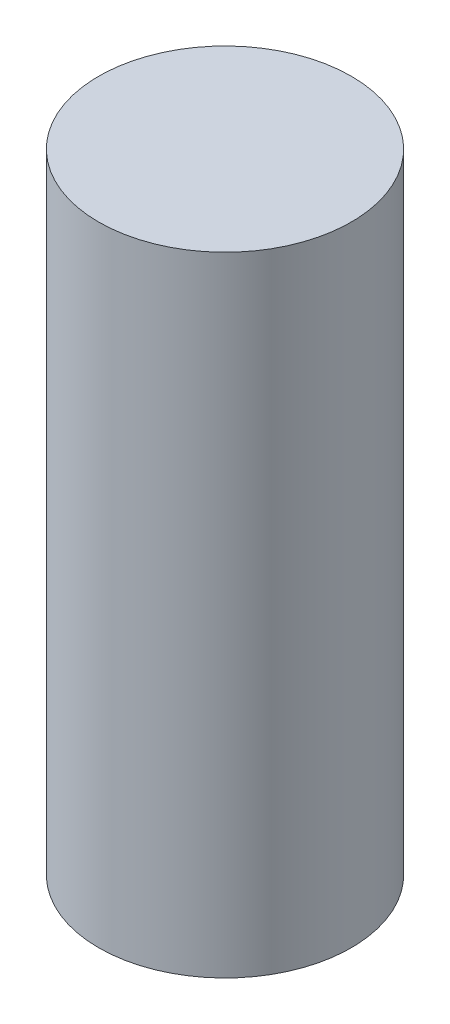
ISO-10303-21;
HEADER;
FILE_DESCRIPTION(('STEP AP214'),'2;1');
FILE_NAME('part.step','',(''),(''),'','','');
FILE_SCHEMA(('AUTOMOTIVE_DESIGN { 1 0 10303 214 1 1 1 1 }'));
ENDSEC;
DATA;
#1=APPLICATION_CONTEXT('core data for automotive mechanical design processes');
#2=APPLICATION_PROTOCOL_DEFINITION('international standard','automotive_design',2000,#1);
#3=PRODUCT_CONTEXT('',#1,'mechanical');
#4=PRODUCT('Part','Part','',(#3));
#5=PRODUCT_RELATED_PRODUCT_CATEGORY('part','',(#4));
#6=PRODUCT_DEFINITION_FORMATION('','',#4);
#7=PRODUCT_DEFINITION_CONTEXT('part definition',#1,'design');
#8=PRODUCT_DEFINITION('design','',#6,#7);
#9=PRODUCT_DEFINITION_SHAPE('','',#8);
#10=(LENGTH_UNIT() NAMED_UNIT(*) SI_UNIT(.MILLI.,.METRE.));
#11=(NAMED_UNIT(*) PLANE_ANGLE_UNIT() SI_UNIT($,.RADIAN.));
#12=(NAMED_UNIT(*) SI_UNIT($,.STERADIAN.) SOLID_ANGLE_UNIT());
#13=UNCERTAINTY_MEASURE_WITH_UNIT(LENGTH_MEASURE(1.E-05),#10,'distance_accuracy_value','');
#14=(GEOMETRIC_REPRESENTATION_CONTEXT(3) GLOBAL_UNCERTAINTY_ASSIGNED_CONTEXT((#13)) GLOBAL_UNIT_ASSIGNED_CONTEXT((#10,
#11,#12)) REPRESENTATION_CONTEXT('',''));
#15=CARTESIAN_POINT('',(0.,0.,0.));
#16=DIRECTION('',(0.,0.,1.));
#17=DIRECTION('',(1.,0.,0.));
#18=AXIS2_PLACEMENT_3D('',#15,#16,#17);
#19=CARTESIAN_POINT('',(0.,12.7,0.));
#20=DIRECTION('',(0.,-1.,0.));
#21=DIRECTION('',(0.,0.,-1.));
#22=AXIS2_PLACEMENT_3D('',#19,#20,#21);
#23=CYLINDRICAL_SURFACE('',#22,2.5527);
#24=CARTESIAN_POINT('',(0.,12.7,0.));
#25=DIRECTION('',(0.,1.,0.));
#26=DIRECTION('',(0.,0.,1.));
#27=AXIS2_PLACEMENT_3D('',#24,#25,#26);
#28=CIRCLE('',#27,2.5527);
#29=CARTESIAN_POINT('',(0.,12.7,2.5527));
#30=VERTEX_POINT('',#29);
#31=EDGE_CURVE('E10',#30,#30,#28,.T.);
#32=ORIENTED_EDGE('',*,*,#31,.F.);
#33=EDGE_LOOP('',(#32));
#34=FACE_BOUND('',#33,.T.);
#35=CARTESIAN_POINT('',(0.,0.,0.));
#36=DIRECTION('',(0.,1.,0.));
#37=DIRECTION('',(0.,0.,1.));
#38=AXIS2_PLACEMENT_3D('',#35,#36,#37);
#39=CIRCLE('',#38,2.5527);
#40=CARTESIAN_POINT('',(0.,0.,2.5527));
#41=VERTEX_POINT('',#40);
#42=EDGE_CURVE('E38',#41,#41,#39,.T.);
#43=ORIENTED_EDGE('',*,*,#42,.T.);
#44=EDGE_LOOP('',(#43));
#45=FACE_BOUND('',#44,.T.);
#46=ADVANCED_FACE('F35',(#34,#45),#23,.T.);
#47=CARTESIAN_POINT('',(0.,12.7,0.));
#48=DIRECTION('',(0.,1.,0.));
#49=DIRECTION('',(0.,0.,1.));
#50=AXIS2_PLACEMENT_3D('',#47,#48,#49);
#51=PLANE('',#50);
#52=ORIENTED_EDGE('',*,*,#31,.T.);
#53=EDGE_LOOP('',(#52));
#54=FACE_BOUND('',#53,.T.);
#55=ADVANCED_FACE('F50',(#54),#51,.T.);
#56=CARTESIAN_POINT('',(0.,0.,0.));
#57=DIRECTION('',(0.,1.,0.));
#58=DIRECTION('',(0.,0.,1.));
#59=AXIS2_PLACEMENT_3D('',#56,#57,#58);
#60=PLANE('',#59);
#61=ORIENTED_EDGE('',*,*,#42,.F.);
#62=EDGE_LOOP('',(#61));
#63=FACE_BOUND('',#62,.T.);
#64=ADVANCED_FACE('F48',(#63),#60,.F.);
#65=CLOSED_SHELL('',(#46,#55,#64));
#66=MANIFOLD_SOLID_BREP('B2',#65);
#67=ADVANCED_BREP_SHAPE_REPRESENTATION('',(#18,#66),#14);
#68=SHAPE_DEFINITION_REPRESENTATION(#9,#67);
ENDSEC;
END-ISO-10303-21;
